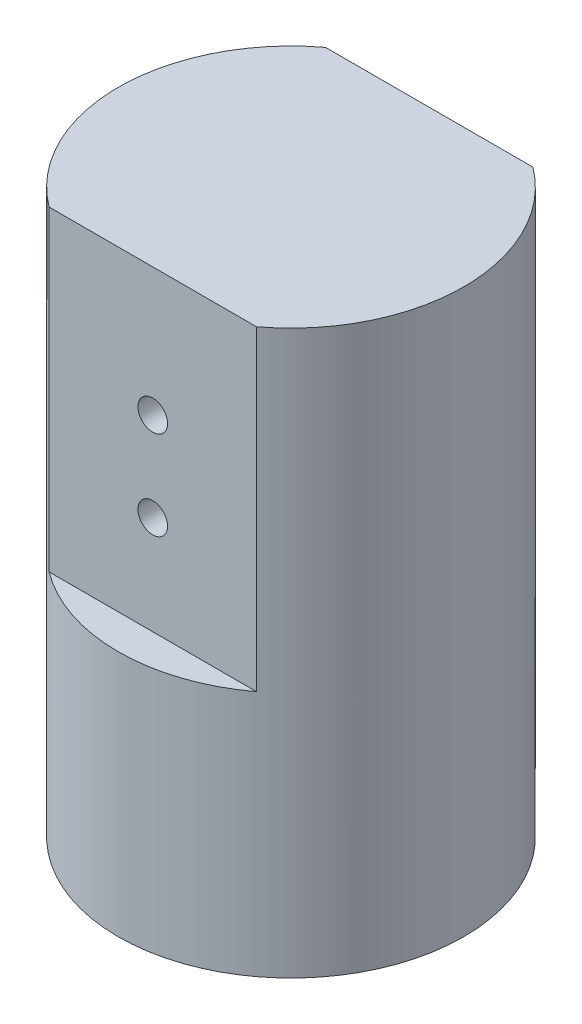
ISO-10303-21;
HEADER;
FILE_DESCRIPTION(('STEP AP214'),'2;1');
FILE_NAME('part.step','',(''),(''),'','','');
FILE_SCHEMA(('AUTOMOTIVE_DESIGN { 1 0 10303 214 1 1 1 1 }'));
ENDSEC;
DATA;
#1=APPLICATION_CONTEXT('core data for automotive mechanical design processes');
#2=APPLICATION_PROTOCOL_DEFINITION('international standard','automotive_design',2000,#1);
#3=PRODUCT_CONTEXT('',#1,'mechanical');
#4=PRODUCT('Part','Part','',(#3));
#5=PRODUCT_RELATED_PRODUCT_CATEGORY('part','',(#4));
#6=PRODUCT_DEFINITION_FORMATION('','',#4);
#7=PRODUCT_DEFINITION_CONTEXT('part definition',#1,'design');
#8=PRODUCT_DEFINITION('design','',#6,#7);
#9=PRODUCT_DEFINITION_SHAPE('','',#8);
#10=(LENGTH_UNIT() NAMED_UNIT(*) SI_UNIT(.MILLI.,.METRE.));
#11=(NAMED_UNIT(*) PLANE_ANGLE_UNIT() SI_UNIT($,.RADIAN.));
#12=(NAMED_UNIT(*) SI_UNIT($,.STERADIAN.) SOLID_ANGLE_UNIT());
#13=UNCERTAINTY_MEASURE_WITH_UNIT(LENGTH_MEASURE(1.E-05),#10,'distance_accuracy_value','');
#14=(GEOMETRIC_REPRESENTATION_CONTEXT(3) GLOBAL_UNCERTAINTY_ASSIGNED_CONTEXT((#13)) GLOBAL_UNIT_ASSIGNED_CONTEXT((#10,
#11,#12)) REPRESENTATION_CONTEXT('',''));
#15=CARTESIAN_POINT('',(0.,0.,0.));
#16=DIRECTION('',(0.,0.,1.));
#17=DIRECTION('',(1.,0.,0.));
#18=AXIS2_PLACEMENT_3D('',#15,#16,#17);
#19=CARTESIAN_POINT('',(0.,91.44,0.));
#20=DIRECTION('',(0.,-1.,0.));
#21=DIRECTION('',(0.,0.,-1.));
#22=AXIS2_PLACEMENT_3D('',#19,#20,#21);
#23=CYLINDRICAL_SURFACE('',#22,22.225);
#24=CARTESIAN_POINT('',(0.,91.44,0.));
#25=DIRECTION('',(0.,1.,0.));
#26=DIRECTION('',(0.,0.,1.));
#27=AXIS2_PLACEMENT_3D('',#24,#25,#26);
#28=CIRCLE('',#27,22.225);
#29=CARTESIAN_POINT('',(13.3349999999989,91.44,17.7800000000008));
#30=VERTEX_POINT('',#29);
#31=CARTESIAN_POINT('',(13.3349999999989,91.44,-17.7800000000008));
#32=VERTEX_POINT('',#31);
#33=EDGE_CURVE('E102',#30,#32,#28,.T.);
#34=ORIENTED_EDGE('',*,*,#33,.F.);
#35=DIRECTION('',(0.,-1.,0.));
#36=VECTOR('',#35,1.);
#37=CARTESIAN_POINT('',(13.3349999999989,91.44,17.7800000000008));
#38=LINE('',#37,#36);
#39=CARTESIAN_POINT('',(13.3349999999989,50.7999999999999,17.7800000000008));
#40=VERTEX_POINT('',#39);
#41=EDGE_CURVE('E117',#40,#30,#38,.F.);
#42=ORIENTED_EDGE('',*,*,#41,.F.);
#43=CARTESIAN_POINT('',(0.,50.8000000000001,0.));
#44=DIRECTION('',(0.,-1.,0.));
#45=DIRECTION('',(0.,0.,-1.));
#46=AXIS2_PLACEMENT_3D('',#43,#44,#45);
#47=CIRCLE('',#46,22.225);
#48=CARTESIAN_POINT('',(-13.3349999999989,50.7999999999999,17.7800000000008));
#49=VERTEX_POINT('',#48);
#50=EDGE_CURVE('E150',#49,#40,#47,.F.);
#51=ORIENTED_EDGE('',*,*,#50,.F.);
#52=DIRECTION('',(0.,-1.,0.));
#53=VECTOR('',#52,1.);
#54=CARTESIAN_POINT('',(-13.3349999999989,91.44,17.7800000000008));
#55=LINE('',#54,#53);
#56=CARTESIAN_POINT('',(-13.3349999999989,91.44,17.7800000000008));
#57=VERTEX_POINT('',#56);
#58=EDGE_CURVE('E138',#57,#49,#55,.T.);
#59=ORIENTED_EDGE('',*,*,#58,.F.);
#60=CARTESIAN_POINT('',(-13.3349999999989,91.44,-17.7800000000008));
#61=VERTEX_POINT('',#60);
#62=EDGE_CURVE('E149',#61,#57,#28,.T.);
#63=ORIENTED_EDGE('',*,*,#62,.F.);
#64=DIRECTION('',(0.,-1.,0.));
#65=VECTOR('',#64,1.);
#66=CARTESIAN_POINT('',(-13.3349999999989,91.44,-17.7800000000008));
#67=LINE('',#66,#65);
#68=CARTESIAN_POINT('',(-13.3349999999989,50.7999999999999,-17.7800000000008));
#69=VERTEX_POINT('',#68);
#70=EDGE_CURVE('E109',#69,#61,#67,.F.);
#71=ORIENTED_EDGE('',*,*,#70,.F.);
#72=CARTESIAN_POINT('',(0.,50.8000000000001,0.));
#73=DIRECTION('',(0.,-1.,0.));
#74=DIRECTION('',(0.,0.,-1.));
#75=AXIS2_PLACEMENT_3D('',#72,#73,#74);
#76=CIRCLE('',#75,22.225);
#77=CARTESIAN_POINT('',(13.3349999999989,50.7999999999999,-17.7800000000008));
#78=VERTEX_POINT('',#77);
#79=EDGE_CURVE('E162',#78,#69,#76,.F.);
#80=ORIENTED_EDGE('',*,*,#79,.F.);
#81=DIRECTION('',(0.,-1.,0.));
#82=VECTOR('',#81,1.);
#83=CARTESIAN_POINT('',(13.3349999999989,91.44,-17.7800000000008));
#84=LINE('',#83,#82);
#85=EDGE_CURVE('E156',#32,#78,#84,.T.);
#86=ORIENTED_EDGE('',*,*,#85,.F.);
#87=EDGE_LOOP('',(#34,#42,#51,#59,#63,#71,#80,#86));
#88=FACE_BOUND('',#87,.T.);
#89=CARTESIAN_POINT('',(0.,19.0499999999999,0.));
#90=DIRECTION('',(0.,-1.,0.));
#91=DIRECTION('',(1.,0.,0.));
#92=AXIS2_PLACEMENT_3D('',#89,#90,#91);
#93=CIRCLE('',#92,22.225);
#94=CARTESIAN_POINT('',(22.225,19.0499999999999,0.));
#95=VERTEX_POINT('',#94);
#96=EDGE_CURVE('E12',#95,#95,#93,.T.);
#97=ORIENTED_EDGE('',*,*,#96,.F.);
#98=EDGE_LOOP('',(#97));
#99=FACE_BOUND('',#98,.T.);
#100=ADVANCED_FACE('F95',(#88,#99),#23,.T.);
#101=CARTESIAN_POINT('',(0.,91.44,0.));
#102=DIRECTION('',(0.,1.,0.));
#103=DIRECTION('',(0.,0.,1.));
#104=AXIS2_PLACEMENT_3D('',#101,#102,#103);
#105=PLANE('',#104);
#106=DIRECTION('',(1.,0.,0.));
#107=VECTOR('',#106,1.);
#108=CARTESIAN_POINT('',(-22.226,91.44,17.7800000000008));
#109=LINE('',#108,#107);
#110=EDGE_CURVE('E135',#57,#30,#109,.T.);
#111=ORIENTED_EDGE('',*,*,#110,.T.);
#112=ORIENTED_EDGE('',*,*,#33,.T.);
#113=DIRECTION('',(1.,0.,0.));
#114=VECTOR('',#113,1.);
#115=CARTESIAN_POINT('',(-22.226,91.44,-17.7800000000008));
#116=LINE('',#115,#114);
#117=EDGE_CURVE('E153',#61,#32,#116,.T.);
#118=ORIENTED_EDGE('',*,*,#117,.F.);
#119=ORIENTED_EDGE('',*,*,#62,.T.);
#120=EDGE_LOOP('',(#111,#112,#118,#119));
#121=FACE_BOUND('',#120,.T.);
#122=ADVANCED_FACE('F152',(#121),#105,.T.);
#123=CARTESIAN_POINT('',(-22.226,91.44,-17.7800000000008));
#124=DIRECTION('',(0.,0.,1.));
#125=DIRECTION('',(0.,-1.,0.));
#126=AXIS2_PLACEMENT_3D('',#123,#124,#125);
#127=PLANE('',#126);
#128=CARTESIAN_POINT('',(0.,74.9299999999999,-17.7800000000008));
#129=DIRECTION('',(0.,0.,1.));
#130=DIRECTION('',(0.,-1.,0.));
#131=AXIS2_PLACEMENT_3D('',#128,#129,#130);
#132=CIRCLE('',#131,1.905);
#133=CARTESIAN_POINT('',(0.,73.0249999999999,-17.7800000000008));
#134=VERTEX_POINT('',#133);
#135=EDGE_CURVE('E164',#134,#134,#132,.T.);
#136=ORIENTED_EDGE('',*,*,#135,.T.);
#137=EDGE_LOOP('',(#136));
#138=FACE_BOUND('',#137,.T.);
#139=CARTESIAN_POINT('',(0.,63.5,-17.7800000000008));
#140=DIRECTION('',(0.,0.,1.));
#141=DIRECTION('',(0.,-1.,0.));
#142=AXIS2_PLACEMENT_3D('',#139,#140,#141);
#143=CIRCLE('',#142,1.905);
#144=CARTESIAN_POINT('',(0.,61.595,-17.7800000000008));
#145=VERTEX_POINT('',#144);
#146=EDGE_CURVE('E170',#145,#145,#143,.T.);
#147=ORIENTED_EDGE('',*,*,#146,.T.);
#148=EDGE_LOOP('',(#147));
#149=FACE_BOUND('',#148,.T.);
#150=ORIENTED_EDGE('',*,*,#70,.T.);
#151=ORIENTED_EDGE('',*,*,#117,.T.);
#152=ORIENTED_EDGE('',*,*,#85,.T.);
#153=DIRECTION('',(1.,0.,0.));
#154=VECTOR('',#153,1.);
#155=CARTESIAN_POINT('',(-22.226,50.7999999999999,-17.7800000000008));
#156=LINE('',#155,#154);
#157=EDGE_CURVE('E160',#69,#78,#156,.T.);
#158=ORIENTED_EDGE('',*,*,#157,.F.);
#159=EDGE_LOOP('',(#150,#151,#152,#158));
#160=FACE_BOUND('',#159,.T.);
#161=ADVANCED_FACE('F196',(#138,#149,#160),#127,.F.);
#162=CARTESIAN_POINT('',(-22.226,50.7999999999999,-17.7800000000008));
#163=DIRECTION('',(0.,-1.,0.));
#164=DIRECTION('',(0.,0.,-1.));
#165=AXIS2_PLACEMENT_3D('',#162,#163,#164);
#166=PLANE('',#165);
#167=ORIENTED_EDGE('',*,*,#157,.T.);
#168=ORIENTED_EDGE('',*,*,#79,.T.);
#169=EDGE_LOOP('',(#167,#168));
#170=FACE_BOUND('',#169,.T.);
#171=ADVANCED_FACE('F186',(#170),#166,.F.);
#172=CARTESIAN_POINT('',(-22.226,91.44,17.7800000000008));
#173=DIRECTION('',(0.,0.,-1.));
#174=DIRECTION('',(0.,1.,0.));
#175=AXIS2_PLACEMENT_3D('',#172,#173,#174);
#176=PLANE('',#175);
#177=CARTESIAN_POINT('',(0.,74.9299999999999,17.7800000000008));
#178=DIRECTION('',(0.,0.,1.));
#179=DIRECTION('',(1.,0.,0.));
#180=AXIS2_PLACEMENT_3D('',#177,#178,#179);
#181=CIRCLE('',#180,1.905);
#182=CARTESIAN_POINT('',(1.905,74.9299999999999,17.7800000000008));
#183=VERTEX_POINT('',#182);
#184=EDGE_CURVE('E173',#183,#183,#181,.T.);
#185=ORIENTED_EDGE('',*,*,#184,.F.);
#186=EDGE_LOOP('',(#185));
#187=FACE_BOUND('',#186,.T.);
#188=CARTESIAN_POINT('',(0.,63.5,17.7800000000008));
#189=DIRECTION('',(0.,0.,1.));
#190=DIRECTION('',(1.,0.,0.));
#191=AXIS2_PLACEMENT_3D('',#188,#189,#190);
#192=CIRCLE('',#191,1.905);
#193=CARTESIAN_POINT('',(1.90500000000001,63.5,17.7800000000008));
#194=VERTEX_POINT('',#193);
#195=EDGE_CURVE('E174',#194,#194,#192,.T.);
#196=ORIENTED_EDGE('',*,*,#195,.F.);
#197=EDGE_LOOP('',(#196));
#198=FACE_BOUND('',#197,.T.);
#199=ORIENTED_EDGE('',*,*,#41,.T.);
#200=ORIENTED_EDGE('',*,*,#110,.F.);
#201=ORIENTED_EDGE('',*,*,#58,.T.);
#202=DIRECTION('',(1.,0.,0.));
#203=VECTOR('',#202,1.);
#204=CARTESIAN_POINT('',(-22.226,50.7999999999999,17.7800000000008));
#205=LINE('',#204,#203);
#206=EDGE_CURVE('E144',#49,#40,#205,.T.);
#207=ORIENTED_EDGE('',*,*,#206,.T.);
#208=EDGE_LOOP('',(#199,#200,#201,#207));
#209=FACE_BOUND('',#208,.T.);
#210=ADVANCED_FACE('F137',(#187,#198,#209),#176,.F.);
#211=CARTESIAN_POINT('',(-22.226,50.7999999999999,17.7800000000008));
#212=DIRECTION('',(0.,-1.,0.));
#213=DIRECTION('',(0.,0.,-1.));
#214=AXIS2_PLACEMENT_3D('',#211,#212,#213);
#215=PLANE('',#214);
#216=ORIENTED_EDGE('',*,*,#50,.T.);
#217=ORIENTED_EDGE('',*,*,#206,.F.);
#218=EDGE_LOOP('',(#216,#217));
#219=FACE_BOUND('',#218,.T.);
#220=ADVANCED_FACE('F185',(#219),#215,.F.);
#221=CARTESIAN_POINT('',(0.,63.5,-22.225));
#222=DIRECTION('',(0.,0.,1.));
#223=DIRECTION('',(1.,0.,0.));
#224=AXIS2_PLACEMENT_3D('',#221,#222,#223);
#225=CYLINDRICAL_SURFACE('',#224,1.905);
#226=ORIENTED_EDGE('',*,*,#195,.T.);
#227=EDGE_LOOP('',(#226));
#228=FACE_BOUND('',#227,.T.);
#229=ORIENTED_EDGE('',*,*,#146,.F.);
#230=EDGE_LOOP('',(#229));
#231=FACE_BOUND('',#230,.T.);
#232=ADVANCED_FACE('F190',(#228,#231),#225,.F.);
#233=CARTESIAN_POINT('',(0.,74.9299999999999,-22.225));
#234=DIRECTION('',(0.,0.,1.));
#235=DIRECTION('',(1.,0.,0.));
#236=AXIS2_PLACEMENT_3D('',#233,#234,#235);
#237=CYLINDRICAL_SURFACE('',#236,1.905);
#238=ORIENTED_EDGE('',*,*,#184,.T.);
#239=EDGE_LOOP('',(#238));
#240=FACE_BOUND('',#239,.T.);
#241=ORIENTED_EDGE('',*,*,#135,.F.);
#242=EDGE_LOOP('',(#241));
#243=FACE_BOUND('',#242,.T.);
#244=ADVANCED_FACE('F180',(#240,#243),#237,.F.);
#245=CARTESIAN_POINT('',(22.225,19.0499999999999,22.2250000000001));
#246=DIRECTION('',(0.,-1.,0.));
#247=DIRECTION('',(1.,0.,0.));
#248=AXIS2_PLACEMENT_3D('',#245,#246,#247);
#249=PLANE('',#248);
#250=ORIENTED_EDGE('',*,*,#96,.T.);
#251=EDGE_LOOP('',(#250));
#252=FACE_BOUND('',#251,.T.);
#253=ADVANCED_FACE('F218',(#252),#249,.T.);
#254=CLOSED_SHELL('',(#100,#122,#161,#171,#210,#220,#232,#244,#253));
#255=MANIFOLD_SOLID_BREP('B2',#254);
#256=ADVANCED_BREP_SHAPE_REPRESENTATION('',(#18,#255),#14);
#257=SHAPE_DEFINITION_REPRESENTATION(#9,#256);
ENDSEC;
END-ISO-10303-21;
